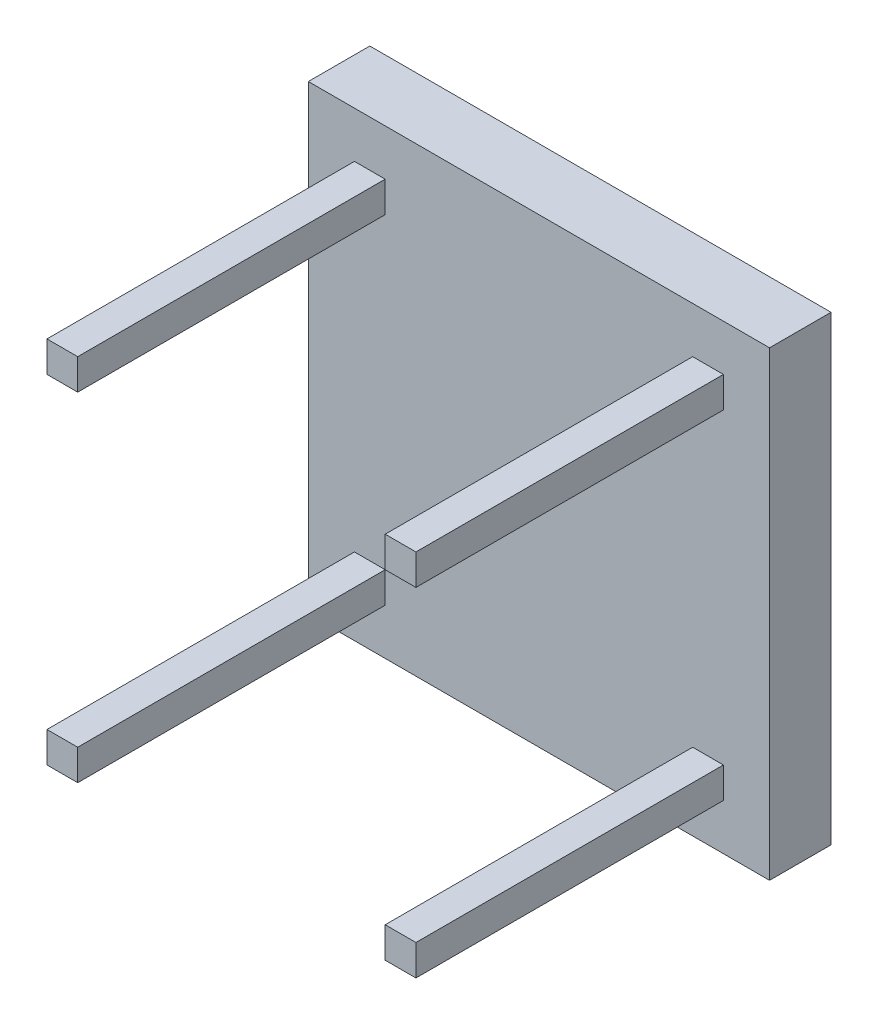
ISO-10303-21;
HEADER;
FILE_DESCRIPTION(('STEP AP214'),'2;1');
FILE_NAME('part.step','',(''),(''),'','','');
FILE_SCHEMA(('AUTOMOTIVE_DESIGN { 1 0 10303 214 1 1 1 1 }'));
ENDSEC;
DATA;
#1=APPLICATION_CONTEXT('core data for automotive mechanical design processes');
#2=APPLICATION_PROTOCOL_DEFINITION('international standard','automotive_design',2000,#1);
#3=PRODUCT_CONTEXT('',#1,'mechanical');
#4=PRODUCT('Part','Part','',(#3));
#5=PRODUCT_RELATED_PRODUCT_CATEGORY('part','',(#4));
#6=PRODUCT_DEFINITION_FORMATION('','',#4);
#7=PRODUCT_DEFINITION_CONTEXT('part definition',#1,'design');
#8=PRODUCT_DEFINITION('design','',#6,#7);
#9=PRODUCT_DEFINITION_SHAPE('','',#8);
#10=(LENGTH_UNIT() NAMED_UNIT(*) SI_UNIT(.MILLI.,.METRE.));
#11=(NAMED_UNIT(*) PLANE_ANGLE_UNIT() SI_UNIT($,.RADIAN.));
#12=(NAMED_UNIT(*) SI_UNIT($,.STERADIAN.) SOLID_ANGLE_UNIT());
#13=UNCERTAINTY_MEASURE_WITH_UNIT(LENGTH_MEASURE(1.E-05),#10,'distance_accuracy_value','');
#14=(GEOMETRIC_REPRESENTATION_CONTEXT(3) GLOBAL_UNCERTAINTY_ASSIGNED_CONTEXT((#13)) GLOBAL_UNIT_ASSIGNED_CONTEXT((#10,
#11,#12)) REPRESENTATION_CONTEXT('',''));
#15=CARTESIAN_POINT('',(0.,0.,0.));
#16=DIRECTION('',(0.,0.,1.));
#17=DIRECTION('',(1.,0.,0.));
#18=AXIS2_PLACEMENT_3D('',#15,#16,#17);
#19=CARTESIAN_POINT('',(0.,0.,40.));
#20=DIRECTION('',(0.,0.,-1.));
#21=DIRECTION('',(-1.,0.,0.));
#22=AXIS2_PLACEMENT_3D('',#19,#20,#21);
#23=PLANE('',#22);
#24=DIRECTION('',(0.,1.,0.));
#25=VECTOR('',#24,1.);
#26=CARTESIAN_POINT('',(-100.,0.,40.));
#27=LINE('',#26,#25);
#28=CARTESIAN_POINT('',(-100.,100.,40.));
#29=VERTEX_POINT('',#28);
#30=CARTESIAN_POINT('',(-100.,120.,40.));
#31=VERTEX_POINT('',#30);
#32=EDGE_CURVE('E260',#29,#31,#27,.T.);
#33=ORIENTED_EDGE('',*,*,#32,.F.);
#34=DIRECTION('',(1.,0.,0.));
#35=VECTOR('',#34,1.);
#36=CARTESIAN_POINT('',(0.,100.,40.));
#37=LINE('',#36,#35);
#38=CARTESIAN_POINT('',(-120.,100.,40.));
#39=VERTEX_POINT('',#38);
#40=EDGE_CURVE('E266',#39,#29,#37,.T.);
#41=ORIENTED_EDGE('',*,*,#40,.F.);
#42=DIRECTION('',(0.,-1.,0.));
#43=VECTOR('',#42,1.);
#44=CARTESIAN_POINT('',(-120.,0.,40.));
#45=LINE('',#44,#43);
#46=CARTESIAN_POINT('',(-120.,120.,40.));
#47=VERTEX_POINT('',#46);
#48=EDGE_CURVE('E283',#47,#39,#45,.T.);
#49=ORIENTED_EDGE('',*,*,#48,.F.);
#50=DIRECTION('',(-1.,0.,0.));
#51=VECTOR('',#50,1.);
#52=CARTESIAN_POINT('',(0.,120.,40.));
#53=LINE('',#52,#51);
#54=EDGE_CURVE('E279',#31,#47,#53,.T.);
#55=ORIENTED_EDGE('',*,*,#54,.F.);
#56=EDGE_LOOP('',(#33,#41,#49,#55));
#57=FACE_BOUND('',#56,.T.);
#58=DIRECTION('',(1.,0.,0.));
#59=VECTOR('',#58,1.);
#60=CARTESIAN_POINT('',(0.,120.,40.));
#61=LINE('',#60,#59);
#62=CARTESIAN_POINT('',(100.,120.,40.));
#63=VERTEX_POINT('',#62);
#64=CARTESIAN_POINT('',(120.,120.,40.));
#65=VERTEX_POINT('',#64);
#66=EDGE_CURVE('E327',#63,#65,#61,.T.);
#67=ORIENTED_EDGE('',*,*,#66,.T.);
#68=DIRECTION('',(0.,-1.,0.));
#69=VECTOR('',#68,1.);
#70=CARTESIAN_POINT('',(120.,2.49800180540661E-13,40.));
#71=LINE('',#70,#69);
#72=CARTESIAN_POINT('',(120.,100.,40.));
#73=VERTEX_POINT('',#72);
#74=EDGE_CURVE('E305',#65,#73,#71,.T.);
#75=ORIENTED_EDGE('',*,*,#74,.T.);
#76=DIRECTION('',(-1.,0.,0.));
#77=VECTOR('',#76,1.);
#78=CARTESIAN_POINT('',(0.,100.,40.));
#79=LINE('',#78,#77);
#80=CARTESIAN_POINT('',(100.,100.,40.));
#81=VERTEX_POINT('',#80);
#82=EDGE_CURVE('E311',#73,#81,#79,.T.);
#83=ORIENTED_EDGE('',*,*,#82,.T.);
#84=DIRECTION('',(0.,1.,0.));
#85=VECTOR('',#84,1.);
#86=CARTESIAN_POINT('',(100.,0.,40.));
#87=LINE('',#86,#85);
#88=EDGE_CURVE('E331',#81,#63,#87,.T.);
#89=ORIENTED_EDGE('',*,*,#88,.T.);
#90=EDGE_LOOP('',(#67,#75,#83,#89));
#91=FACE_BOUND('',#90,.T.);
#92=DIRECTION('',(-1.,0.,0.));
#93=VECTOR('',#92,1.);
#94=CARTESIAN_POINT('',(-150.,150.,40.));
#95=LINE('',#94,#93);
#96=CARTESIAN_POINT('',(150.,150.,40.));
#97=VERTEX_POINT('',#96);
#98=CARTESIAN_POINT('',(-150.,150.,40.));
#99=VERTEX_POINT('',#98);
#100=EDGE_CURVE('E351',#97,#99,#95,.T.);
#101=ORIENTED_EDGE('',*,*,#100,.T.);
#102=DIRECTION('',(0.,-1.,0.));
#103=VECTOR('',#102,1.);
#104=CARTESIAN_POINT('',(-150.,-150.,40.));
#105=LINE('',#104,#103);
#106=CARTESIAN_POINT('',(-150.,-150.,40.));
#107=VERTEX_POINT('',#106);
#108=EDGE_CURVE('E355',#99,#107,#105,.T.);
#109=ORIENTED_EDGE('',*,*,#108,.T.);
#110=DIRECTION('',(1.,0.,0.));
#111=VECTOR('',#110,1.);
#112=CARTESIAN_POINT('',(150.,-150.,40.));
#113=LINE('',#112,#111);
#114=CARTESIAN_POINT('',(150.,-150.,40.));
#115=VERTEX_POINT('',#114);
#116=EDGE_CURVE('E359',#107,#115,#113,.T.);
#117=ORIENTED_EDGE('',*,*,#116,.T.);
#118=DIRECTION('',(0.,1.,0.));
#119=VECTOR('',#118,1.);
#120=CARTESIAN_POINT('',(150.,150.,40.));
#121=LINE('',#120,#119);
#122=EDGE_CURVE('E362',#115,#97,#121,.T.);
#123=ORIENTED_EDGE('',*,*,#122,.T.);
#124=EDGE_LOOP('',(#101,#109,#117,#123));
#125=FACE_BOUND('',#124,.T.);
#126=DIRECTION('',(0.,1.,0.));
#127=VECTOR('',#126,1.);
#128=CARTESIAN_POINT('',(-120.,0.,40.));
#129=LINE('',#128,#127);
#130=CARTESIAN_POINT('',(-120.,-120.,40.));
#131=VERTEX_POINT('',#130);
#132=CARTESIAN_POINT('',(-120.,-100.,40.));
#133=VERTEX_POINT('',#132);
#134=EDGE_CURVE('E214',#131,#133,#129,.T.);
#135=ORIENTED_EDGE('',*,*,#134,.T.);
#136=DIRECTION('',(1.,0.,0.));
#137=VECTOR('',#136,1.);
#138=CARTESIAN_POINT('',(0.,-100.,40.));
#139=LINE('',#138,#137);
#140=CARTESIAN_POINT('',(-100.,-100.,40.));
#141=VERTEX_POINT('',#140);
#142=EDGE_CURVE('E209',#133,#141,#139,.T.);
#143=ORIENTED_EDGE('',*,*,#142,.T.);
#144=DIRECTION('',(0.,-1.,0.));
#145=VECTOR('',#144,1.);
#146=CARTESIAN_POINT('',(-100.,0.,40.));
#147=LINE('',#146,#145);
#148=CARTESIAN_POINT('',(-100.,-120.,40.));
#149=VERTEX_POINT('',#148);
#150=EDGE_CURVE('E225',#141,#149,#147,.T.);
#151=ORIENTED_EDGE('',*,*,#150,.T.);
#152=DIRECTION('',(-1.,0.,0.));
#153=VECTOR('',#152,1.);
#154=CARTESIAN_POINT('',(3.33066907387546E-13,-120.,40.));
#155=LINE('',#154,#153);
#156=EDGE_CURVE('E241',#149,#131,#155,.T.);
#157=ORIENTED_EDGE('',*,*,#156,.T.);
#158=EDGE_LOOP('',(#135,#143,#151,#157));
#159=FACE_BOUND('',#158,.T.);
#160=DIRECTION('',(-1.,0.,0.));
#161=VECTOR('',#160,1.);
#162=CARTESIAN_POINT('',(0.,-100.,40.));
#163=LINE('',#162,#161);
#164=CARTESIAN_POINT('',(120.,-100.,40.));
#165=VERTEX_POINT('',#164);
#166=CARTESIAN_POINT('',(100.,-100.,40.));
#167=VERTEX_POINT('',#166);
#168=EDGE_CURVE('E207',#165,#167,#163,.T.);
#169=ORIENTED_EDGE('',*,*,#168,.F.);
#170=DIRECTION('',(0.,1.,0.));
#171=VECTOR('',#170,1.);
#172=CARTESIAN_POINT('',(120.,-2.4980018054066E-13,40.));
#173=LINE('',#172,#171);
#174=CARTESIAN_POINT('',(120.,-120.,40.));
#175=VERTEX_POINT('',#174);
#176=EDGE_CURVE('E204',#175,#165,#173,.T.);
#177=ORIENTED_EDGE('',*,*,#176,.F.);
#178=DIRECTION('',(1.,0.,0.));
#179=VECTOR('',#178,1.);
#180=CARTESIAN_POINT('',(-3.33066907387547E-13,-120.,40.));
#181=LINE('',#180,#179);
#182=CARTESIAN_POINT('',(100.,-120.,40.));
#183=VERTEX_POINT('',#182);
#184=EDGE_CURVE('E68',#183,#175,#181,.T.);
#185=ORIENTED_EDGE('',*,*,#184,.F.);
#186=DIRECTION('',(0.,-1.,0.));
#187=VECTOR('',#186,1.);
#188=CARTESIAN_POINT('',(100.,0.,40.));
#189=LINE('',#188,#187);
#190=EDGE_CURVE('E63',#167,#183,#189,.T.);
#191=ORIENTED_EDGE('',*,*,#190,.F.);
#192=EDGE_LOOP('',(#169,#177,#185,#191));
#193=FACE_BOUND('',#192,.T.);
#194=ADVANCED_FACE('F47',(#57,#91,#125,#159,#193),#23,.F.);
#195=CARTESIAN_POINT('',(-150.,150.,40.));
#196=DIRECTION('',(0.,-1.,0.));
#197=DIRECTION('',(0.,0.,-1.));
#198=AXIS2_PLACEMENT_3D('',#195,#196,#197);
#199=PLANE('',#198);
#200=DIRECTION('',(-1.,0.,0.));
#201=VECTOR('',#200,1.);
#202=CARTESIAN_POINT('',(-150.,150.,0.));
#203=LINE('',#202,#201);
#204=CARTESIAN_POINT('',(150.,150.,0.));
#205=VERTEX_POINT('',#204);
#206=CARTESIAN_POINT('',(-150.,150.,0.));
#207=VERTEX_POINT('',#206);
#208=EDGE_CURVE('E350',#205,#207,#203,.T.);
#209=ORIENTED_EDGE('',*,*,#208,.T.);
#210=DIRECTION('',(0.,0.,-1.));
#211=VECTOR('',#210,1.);
#212=CARTESIAN_POINT('',(-150.,150.,40.));
#213=LINE('',#212,#211);
#214=EDGE_CURVE('E11',#99,#207,#213,.T.);
#215=ORIENTED_EDGE('',*,*,#214,.F.);
#216=ORIENTED_EDGE('',*,*,#100,.F.);
#217=DIRECTION('',(0.,0.,-1.));
#218=VECTOR('',#217,1.);
#219=CARTESIAN_POINT('',(150.,150.,40.));
#220=LINE('',#219,#218);
#221=EDGE_CURVE('E365',#97,#205,#220,.T.);
#222=ORIENTED_EDGE('',*,*,#221,.T.);
#223=EDGE_LOOP('',(#209,#215,#216,#222));
#224=FACE_BOUND('',#223,.T.);
#225=ADVANCED_FACE('F49',(#224),#199,.F.);
#226=CARTESIAN_POINT('',(-150.,-150.,40.));
#227=DIRECTION('',(1.,0.,0.));
#228=DIRECTION('',(0.,1.,0.));
#229=AXIS2_PLACEMENT_3D('',#226,#227,#228);
#230=PLANE('',#229);
#231=DIRECTION('',(0.,-1.,0.));
#232=VECTOR('',#231,1.);
#233=CARTESIAN_POINT('',(-150.,-150.,0.));
#234=LINE('',#233,#232);
#235=CARTESIAN_POINT('',(-150.,-150.,0.));
#236=VERTEX_POINT('',#235);
#237=EDGE_CURVE('E369',#207,#236,#234,.T.);
#238=ORIENTED_EDGE('',*,*,#237,.T.);
#239=DIRECTION('',(0.,0.,-1.));
#240=VECTOR('',#239,1.);
#241=CARTESIAN_POINT('',(-150.,-150.,40.));
#242=LINE('',#241,#240);
#243=EDGE_CURVE('E56',#107,#236,#242,.T.);
#244=ORIENTED_EDGE('',*,*,#243,.F.);
#245=ORIENTED_EDGE('',*,*,#108,.F.);
#246=ORIENTED_EDGE('',*,*,#214,.T.);
#247=EDGE_LOOP('',(#238,#244,#245,#246));
#248=FACE_BOUND('',#247,.T.);
#249=ADVANCED_FACE('F405',(#248),#230,.F.);
#250=CARTESIAN_POINT('',(150.,-150.,40.));
#251=DIRECTION('',(0.,1.,0.));
#252=DIRECTION('',(0.,0.,1.));
#253=AXIS2_PLACEMENT_3D('',#250,#251,#252);
#254=PLANE('',#253);
#255=DIRECTION('',(1.,0.,0.));
#256=VECTOR('',#255,1.);
#257=CARTESIAN_POINT('',(150.,-150.,0.));
#258=LINE('',#257,#256);
#259=CARTESIAN_POINT('',(150.,-150.,0.));
#260=VERTEX_POINT('',#259);
#261=EDGE_CURVE('E372',#236,#260,#258,.T.);
#262=ORIENTED_EDGE('',*,*,#261,.T.);
#263=DIRECTION('',(0.,0.,-1.));
#264=VECTOR('',#263,1.);
#265=CARTESIAN_POINT('',(150.,-150.,40.));
#266=LINE('',#265,#264);
#267=EDGE_CURVE('E380',#115,#260,#266,.T.);
#268=ORIENTED_EDGE('',*,*,#267,.F.);
#269=ORIENTED_EDGE('',*,*,#116,.F.);
#270=ORIENTED_EDGE('',*,*,#243,.T.);
#271=EDGE_LOOP('',(#262,#268,#269,#270));
#272=FACE_BOUND('',#271,.T.);
#273=ADVANCED_FACE('F389',(#272),#254,.F.);
#274=CARTESIAN_POINT('',(150.,150.,40.));
#275=DIRECTION('',(-1.,0.,0.));
#276=DIRECTION('',(0.,0.,1.));
#277=AXIS2_PLACEMENT_3D('',#274,#275,#276);
#278=PLANE('',#277);
#279=DIRECTION('',(0.,1.,0.));
#280=VECTOR('',#279,1.);
#281=CARTESIAN_POINT('',(150.,150.,0.));
#282=LINE('',#281,#280);
#283=EDGE_CURVE('E356',#260,#205,#282,.T.);
#284=ORIENTED_EDGE('',*,*,#283,.T.);
#285=ORIENTED_EDGE('',*,*,#221,.F.);
#286=ORIENTED_EDGE('',*,*,#122,.F.);
#287=ORIENTED_EDGE('',*,*,#267,.T.);
#288=EDGE_LOOP('',(#284,#285,#286,#287));
#289=FACE_BOUND('',#288,.T.);
#290=ADVANCED_FACE('F398',(#289),#278,.F.);
#291=CARTESIAN_POINT('',(0.,0.,0.));
#292=DIRECTION('',(0.,0.,-1.));
#293=DIRECTION('',(-1.,0.,0.));
#294=AXIS2_PLACEMENT_3D('',#291,#292,#293);
#295=PLANE('',#294);
#296=ORIENTED_EDGE('',*,*,#208,.F.);
#297=ORIENTED_EDGE('',*,*,#283,.F.);
#298=ORIENTED_EDGE('',*,*,#261,.F.);
#299=ORIENTED_EDGE('',*,*,#237,.F.);
#300=EDGE_LOOP('',(#296,#297,#298,#299));
#301=FACE_BOUND('',#300,.T.);
#302=ADVANCED_FACE('F395',(#301),#295,.T.);
#303=CARTESIAN_POINT('',(120.,2.49800180540661E-13,240.));
#304=DIRECTION('',(1.,0.,0.));
#305=DIRECTION('',(0.,1.,0.));
#306=AXIS2_PLACEMENT_3D('',#303,#304,#305);
#307=PLANE('',#306);
#308=ORIENTED_EDGE('',*,*,#74,.F.);
#309=DIRECTION('',(0.,0.,-1.));
#310=VECTOR('',#309,1.);
#311=CARTESIAN_POINT('',(120.,120.,240.));
#312=LINE('',#311,#310);
#313=CARTESIAN_POINT('',(120.,120.,240.));
#314=VERTEX_POINT('',#313);
#315=EDGE_CURVE('E347',#314,#65,#312,.T.);
#316=ORIENTED_EDGE('',*,*,#315,.F.);
#317=DIRECTION('',(0.,-1.,0.));
#318=VECTOR('',#317,1.);
#319=CARTESIAN_POINT('',(120.,2.49800180540661E-13,240.));
#320=LINE('',#319,#318);
#321=CARTESIAN_POINT('',(120.,100.,240.));
#322=VERTEX_POINT('',#321);
#323=EDGE_CURVE('E306',#314,#322,#320,.T.);
#324=ORIENTED_EDGE('',*,*,#323,.T.);
#325=DIRECTION('',(0.,0.,-1.));
#326=VECTOR('',#325,1.);
#327=CARTESIAN_POINT('',(120.,100.,240.));
#328=LINE('',#327,#326);
#329=EDGE_CURVE('E323',#322,#73,#328,.T.);
#330=ORIENTED_EDGE('',*,*,#329,.T.);
#331=EDGE_LOOP('',(#308,#316,#324,#330));
#332=FACE_BOUND('',#331,.T.);
#333=ADVANCED_FACE('F422',(#332),#307,.T.);
#334=CARTESIAN_POINT('',(0.,120.,240.));
#335=DIRECTION('',(0.,1.,0.));
#336=DIRECTION('',(0.,0.,1.));
#337=AXIS2_PLACEMENT_3D('',#334,#335,#336);
#338=PLANE('',#337);
#339=ORIENTED_EDGE('',*,*,#66,.F.);
#340=DIRECTION('',(0.,0.,-1.));
#341=VECTOR('',#340,1.);
#342=CARTESIAN_POINT('',(100.,120.,240.));
#343=LINE('',#342,#341);
#344=CARTESIAN_POINT('',(100.,120.,240.));
#345=VERTEX_POINT('',#344);
#346=EDGE_CURVE('E344',#345,#63,#343,.T.);
#347=ORIENTED_EDGE('',*,*,#346,.F.);
#348=DIRECTION('',(1.,0.,0.));
#349=VECTOR('',#348,1.);
#350=CARTESIAN_POINT('',(0.,120.,240.));
#351=LINE('',#350,#349);
#352=EDGE_CURVE('E310',#345,#314,#351,.T.);
#353=ORIENTED_EDGE('',*,*,#352,.T.);
#354=ORIENTED_EDGE('',*,*,#315,.T.);
#355=EDGE_LOOP('',(#339,#347,#353,#354));
#356=FACE_BOUND('',#355,.T.);
#357=ADVANCED_FACE('F448',(#356),#338,.T.);
#358=CARTESIAN_POINT('',(100.,0.,240.));
#359=DIRECTION('',(-1.,0.,0.));
#360=DIRECTION('',(0.,0.,1.));
#361=AXIS2_PLACEMENT_3D('',#358,#359,#360);
#362=PLANE('',#361);
#363=ORIENTED_EDGE('',*,*,#88,.F.);
#364=DIRECTION('',(0.,0.,-1.));
#365=VECTOR('',#364,1.);
#366=CARTESIAN_POINT('',(100.,100.,240.));
#367=LINE('',#366,#365);
#368=CARTESIAN_POINT('',(100.,100.,240.));
#369=VERTEX_POINT('',#368);
#370=EDGE_CURVE('E340',#369,#81,#367,.T.);
#371=ORIENTED_EDGE('',*,*,#370,.F.);
#372=DIRECTION('',(0.,1.,0.));
#373=VECTOR('',#372,1.);
#374=CARTESIAN_POINT('',(100.,0.,240.));
#375=LINE('',#374,#373);
#376=EDGE_CURVE('E315',#369,#345,#375,.T.);
#377=ORIENTED_EDGE('',*,*,#376,.T.);
#378=ORIENTED_EDGE('',*,*,#346,.T.);
#379=EDGE_LOOP('',(#363,#371,#377,#378));
#380=FACE_BOUND('',#379,.T.);
#381=ADVANCED_FACE('F457',(#380),#362,.T.);
#382=CARTESIAN_POINT('',(0.,100.,240.));
#383=DIRECTION('',(0.,-1.,0.));
#384=DIRECTION('',(0.,0.,-1.));
#385=AXIS2_PLACEMENT_3D('',#382,#383,#384);
#386=PLANE('',#385);
#387=ORIENTED_EDGE('',*,*,#82,.F.);
#388=ORIENTED_EDGE('',*,*,#329,.F.);
#389=DIRECTION('',(-1.,0.,0.));
#390=VECTOR('',#389,1.);
#391=CARTESIAN_POINT('',(0.,100.,240.));
#392=LINE('',#391,#390);
#393=EDGE_CURVE('E319',#322,#369,#392,.T.);
#394=ORIENTED_EDGE('',*,*,#393,.T.);
#395=ORIENTED_EDGE('',*,*,#370,.T.);
#396=EDGE_LOOP('',(#387,#388,#394,#395));
#397=FACE_BOUND('',#396,.T.);
#398=ADVANCED_FACE('F466',(#397),#386,.T.);
#399=CARTESIAN_POINT('',(0.,0.,240.));
#400=DIRECTION('',(0.,0.,1.));
#401=DIRECTION('',(1.,0.,0.));
#402=AXIS2_PLACEMENT_3D('',#399,#400,#401);
#403=PLANE('',#402);
#404=ORIENTED_EDGE('',*,*,#323,.F.);
#405=ORIENTED_EDGE('',*,*,#352,.F.);
#406=ORIENTED_EDGE('',*,*,#376,.F.);
#407=ORIENTED_EDGE('',*,*,#393,.F.);
#408=EDGE_LOOP('',(#404,#405,#406,#407));
#409=FACE_BOUND('',#408,.T.);
#410=ADVANCED_FACE('F476',(#409),#403,.T.);
#411=CARTESIAN_POINT('',(-100.,0.,240.));
#412=DIRECTION('',(-1.,0.,0.));
#413=DIRECTION('',(0.,0.,1.));
#414=AXIS2_PLACEMENT_3D('',#411,#412,#413);
#415=PLANE('',#414);
#416=ORIENTED_EDGE('',*,*,#32,.T.);
#417=DIRECTION('',(0.,0.,-1.));
#418=VECTOR('',#417,1.);
#419=CARTESIAN_POINT('',(-100.,120.,240.));
#420=LINE('',#419,#418);
#421=CARTESIAN_POINT('',(-100.,120.,240.));
#422=VERTEX_POINT('',#421);
#423=EDGE_CURVE('E301',#422,#31,#420,.T.);
#424=ORIENTED_EDGE('',*,*,#423,.F.);
#425=DIRECTION('',(0.,1.,0.));
#426=VECTOR('',#425,1.);
#427=CARTESIAN_POINT('',(-100.,0.,240.));
#428=LINE('',#427,#426);
#429=CARTESIAN_POINT('',(-100.,100.,240.));
#430=VERTEX_POINT('',#429);
#431=EDGE_CURVE('E261',#430,#422,#428,.T.);
#432=ORIENTED_EDGE('',*,*,#431,.F.);
#433=DIRECTION('',(0.,0.,-1.));
#434=VECTOR('',#433,1.);
#435=CARTESIAN_POINT('',(-100.,100.,240.));
#436=LINE('',#435,#434);
#437=EDGE_CURVE('E275',#430,#29,#436,.T.);
#438=ORIENTED_EDGE('',*,*,#437,.T.);
#439=EDGE_LOOP('',(#416,#424,#432,#438));
#440=FACE_BOUND('',#439,.T.);
#441=ADVANCED_FACE('F486',(#440),#415,.F.);
#442=CARTESIAN_POINT('',(0.,120.,240.));
#443=DIRECTION('',(0.,-1.,0.));
#444=DIRECTION('',(0.,0.,-1.));
#445=AXIS2_PLACEMENT_3D('',#442,#443,#444);
#446=PLANE('',#445);
#447=ORIENTED_EDGE('',*,*,#54,.T.);
#448=DIRECTION('',(0.,0.,-1.));
#449=VECTOR('',#448,1.);
#450=CARTESIAN_POINT('',(-120.,120.,240.));
#451=LINE('',#450,#449);
#452=CARTESIAN_POINT('',(-120.,120.,240.));
#453=VERTEX_POINT('',#452);
#454=EDGE_CURVE('E297',#453,#47,#451,.T.);
#455=ORIENTED_EDGE('',*,*,#454,.F.);
#456=DIRECTION('',(-1.,0.,0.));
#457=VECTOR('',#456,1.);
#458=CARTESIAN_POINT('',(0.,120.,240.));
#459=LINE('',#458,#457);
#460=EDGE_CURVE('E265',#422,#453,#459,.T.);
#461=ORIENTED_EDGE('',*,*,#460,.F.);
#462=ORIENTED_EDGE('',*,*,#423,.T.);
#463=EDGE_LOOP('',(#447,#455,#461,#462));
#464=FACE_BOUND('',#463,.T.);
#465=ADVANCED_FACE('F496',(#464),#446,.F.);
#466=CARTESIAN_POINT('',(-120.,0.,240.));
#467=DIRECTION('',(1.,0.,0.));
#468=DIRECTION('',(0.,1.,0.));
#469=AXIS2_PLACEMENT_3D('',#466,#467,#468);
#470=PLANE('',#469);
#471=ORIENTED_EDGE('',*,*,#48,.T.);
#472=DIRECTION('',(0.,0.,-1.));
#473=VECTOR('',#472,1.);
#474=CARTESIAN_POINT('',(-120.,100.,240.));
#475=LINE('',#474,#473);
#476=CARTESIAN_POINT('',(-120.,100.,240.));
#477=VERTEX_POINT('',#476);
#478=EDGE_CURVE('E293',#477,#39,#475,.T.);
#479=ORIENTED_EDGE('',*,*,#478,.F.);
#480=DIRECTION('',(0.,-1.,0.));
#481=VECTOR('',#480,1.);
#482=CARTESIAN_POINT('',(-120.,0.,240.));
#483=LINE('',#482,#481);
#484=EDGE_CURVE('E269',#453,#477,#483,.T.);
#485=ORIENTED_EDGE('',*,*,#484,.F.);
#486=ORIENTED_EDGE('',*,*,#454,.T.);
#487=EDGE_LOOP('',(#471,#479,#485,#486));
#488=FACE_BOUND('',#487,.T.);
#489=ADVANCED_FACE('F506',(#488),#470,.F.);
#490=CARTESIAN_POINT('',(0.,100.,240.));
#491=DIRECTION('',(0.,1.,0.));
#492=DIRECTION('',(0.,0.,1.));
#493=AXIS2_PLACEMENT_3D('',#490,#491,#492);
#494=PLANE('',#493);
#495=ORIENTED_EDGE('',*,*,#40,.T.);
#496=ORIENTED_EDGE('',*,*,#437,.F.);
#497=DIRECTION('',(1.,0.,0.));
#498=VECTOR('',#497,1.);
#499=CARTESIAN_POINT('',(0.,100.,240.));
#500=LINE('',#499,#498);
#501=EDGE_CURVE('E272',#477,#430,#500,.T.);
#502=ORIENTED_EDGE('',*,*,#501,.F.);
#503=ORIENTED_EDGE('',*,*,#478,.T.);
#504=EDGE_LOOP('',(#495,#496,#502,#503));
#505=FACE_BOUND('',#504,.T.);
#506=ADVANCED_FACE('F516',(#505),#494,.F.);
#507=CARTESIAN_POINT('',(0.,0.,240.));
#508=DIRECTION('',(0.,0.,1.));
#509=DIRECTION('',(1.,0.,0.));
#510=AXIS2_PLACEMENT_3D('',#507,#508,#509);
#511=PLANE('',#510);
#512=ORIENTED_EDGE('',*,*,#431,.T.);
#513=ORIENTED_EDGE('',*,*,#460,.T.);
#514=ORIENTED_EDGE('',*,*,#484,.T.);
#515=ORIENTED_EDGE('',*,*,#501,.T.);
#516=EDGE_LOOP('',(#512,#513,#514,#515));
#517=FACE_BOUND('',#516,.T.);
#518=ADVANCED_FACE('F526',(#517),#511,.T.);
#519=CARTESIAN_POINT('',(0.,-100.,240.));
#520=DIRECTION('',(0.,1.,0.));
#521=DIRECTION('',(0.,0.,1.));
#522=AXIS2_PLACEMENT_3D('',#519,#520,#521);
#523=PLANE('',#522);
#524=ORIENTED_EDGE('',*,*,#142,.F.);
#525=DIRECTION('',(0.,0.,-1.));
#526=VECTOR('',#525,1.);
#527=CARTESIAN_POINT('',(-120.,-100.,240.));
#528=LINE('',#527,#526);
#529=CARTESIAN_POINT('',(-120.,-100.,240.));
#530=VERTEX_POINT('',#529);
#531=EDGE_CURVE('E257',#530,#133,#528,.T.);
#532=ORIENTED_EDGE('',*,*,#531,.F.);
#533=DIRECTION('',(1.,0.,0.));
#534=VECTOR('',#533,1.);
#535=CARTESIAN_POINT('',(0.,-100.,240.));
#536=LINE('',#535,#534);
#537=CARTESIAN_POINT('',(-100.,-100.,240.));
#538=VERTEX_POINT('',#537);
#539=EDGE_CURVE('E220',#530,#538,#536,.T.);
#540=ORIENTED_EDGE('',*,*,#539,.T.);
#541=DIRECTION('',(0.,0.,-1.));
#542=VECTOR('',#541,1.);
#543=CARTESIAN_POINT('',(-100.,-100.,240.));
#544=LINE('',#543,#542);
#545=EDGE_CURVE('E236',#538,#141,#544,.T.);
#546=ORIENTED_EDGE('',*,*,#545,.T.);
#547=EDGE_LOOP('',(#524,#532,#540,#546));
#548=FACE_BOUND('',#547,.T.);
#549=ADVANCED_FACE('F536',(#548),#523,.T.);
#550=CARTESIAN_POINT('',(-120.,0.,240.));
#551=DIRECTION('',(-1.,0.,0.));
#552=DIRECTION('',(0.,-1.,0.));
#553=AXIS2_PLACEMENT_3D('',#550,#551,#552);
#554=PLANE('',#553);
#555=ORIENTED_EDGE('',*,*,#134,.F.);
#556=DIRECTION('',(0.,0.,-1.));
#557=VECTOR('',#556,1.);
#558=CARTESIAN_POINT('',(-120.,-120.,240.));
#559=LINE('',#558,#557);
#560=CARTESIAN_POINT('',(-120.,-120.,240.));
#561=VERTEX_POINT('',#560);
#562=EDGE_CURVE('E254',#561,#131,#559,.T.);
#563=ORIENTED_EDGE('',*,*,#562,.F.);
#564=DIRECTION('',(0.,1.,0.));
#565=VECTOR('',#564,1.);
#566=CARTESIAN_POINT('',(-120.,0.,240.));
#567=LINE('',#566,#565);
#568=EDGE_CURVE('E224',#561,#530,#567,.T.);
#569=ORIENTED_EDGE('',*,*,#568,.T.);
#570=ORIENTED_EDGE('',*,*,#531,.T.);
#571=EDGE_LOOP('',(#555,#563,#569,#570));
#572=FACE_BOUND('',#571,.T.);
#573=ADVANCED_FACE('F546',(#572),#554,.T.);
#574=CARTESIAN_POINT('',(3.33066907387546E-13,-120.,240.));
#575=DIRECTION('',(0.,-1.,0.));
#576=DIRECTION('',(1.,0.,0.));
#577=AXIS2_PLACEMENT_3D('',#574,#575,#576);
#578=PLANE('',#577);
#579=ORIENTED_EDGE('',*,*,#156,.F.);
#580=DIRECTION('',(0.,0.,-1.));
#581=VECTOR('',#580,1.);
#582=CARTESIAN_POINT('',(-100.,-120.,240.));
#583=LINE('',#582,#581);
#584=CARTESIAN_POINT('',(-100.,-120.,240.));
#585=VERTEX_POINT('',#584);
#586=EDGE_CURVE('E250',#585,#149,#583,.T.);
#587=ORIENTED_EDGE('',*,*,#586,.F.);
#588=DIRECTION('',(-1.,0.,0.));
#589=VECTOR('',#588,1.);
#590=CARTESIAN_POINT('',(3.33066907387546E-13,-120.,240.));
#591=LINE('',#590,#589);
#592=EDGE_CURVE('E229',#585,#561,#591,.T.);
#593=ORIENTED_EDGE('',*,*,#592,.T.);
#594=ORIENTED_EDGE('',*,*,#562,.T.);
#595=EDGE_LOOP('',(#579,#587,#593,#594));
#596=FACE_BOUND('',#595,.T.);
#597=ADVANCED_FACE('F556',(#596),#578,.T.);
#598=CARTESIAN_POINT('',(-100.,0.,240.));
#599=DIRECTION('',(1.,0.,0.));
#600=DIRECTION('',(0.,0.,-1.));
#601=AXIS2_PLACEMENT_3D('',#598,#599,#600);
#602=PLANE('',#601);
#603=ORIENTED_EDGE('',*,*,#150,.F.);
#604=ORIENTED_EDGE('',*,*,#545,.F.);
#605=DIRECTION('',(0.,-1.,0.));
#606=VECTOR('',#605,1.);
#607=CARTESIAN_POINT('',(-100.,0.,240.));
#608=LINE('',#607,#606);
#609=EDGE_CURVE('E233',#538,#585,#608,.T.);
#610=ORIENTED_EDGE('',*,*,#609,.T.);
#611=ORIENTED_EDGE('',*,*,#586,.T.);
#612=EDGE_LOOP('',(#603,#604,#610,#611));
#613=FACE_BOUND('',#612,.T.);
#614=ADVANCED_FACE('F566',(#613),#602,.T.);
#615=CARTESIAN_POINT('',(0.,0.,240.));
#616=DIRECTION('',(0.,0.,1.));
#617=DIRECTION('',(1.,0.,0.));
#618=AXIS2_PLACEMENT_3D('',#615,#616,#617);
#619=PLANE('',#618);
#620=ORIENTED_EDGE('',*,*,#539,.F.);
#621=ORIENTED_EDGE('',*,*,#568,.F.);
#622=ORIENTED_EDGE('',*,*,#592,.F.);
#623=ORIENTED_EDGE('',*,*,#609,.F.);
#624=EDGE_LOOP('',(#620,#621,#622,#623));
#625=FACE_BOUND('',#624,.T.);
#626=ADVANCED_FACE('F576',(#625),#619,.T.);
#627=CARTESIAN_POINT('',(0.,-100.,240.));
#628=DIRECTION('',(0.,-1.,0.));
#629=DIRECTION('',(0.,0.,-1.));
#630=AXIS2_PLACEMENT_3D('',#627,#628,#629);
#631=PLANE('',#630);
#632=ORIENTED_EDGE('',*,*,#168,.T.);
#633=DIRECTION('',(0.,0.,-1.));
#634=VECTOR('',#633,1.);
#635=CARTESIAN_POINT('',(100.,-100.,240.));
#636=LINE('',#635,#634);
#637=CARTESIAN_POINT('',(100.,-100.,240.));
#638=VERTEX_POINT('',#637);
#639=EDGE_CURVE('E186',#638,#167,#636,.T.);
#640=ORIENTED_EDGE('',*,*,#639,.F.);
#641=DIRECTION('',(-1.,0.,0.));
#642=VECTOR('',#641,1.);
#643=CARTESIAN_POINT('',(0.,-100.,240.));
#644=LINE('',#643,#642);
#645=CARTESIAN_POINT('',(120.,-100.,240.));
#646=VERTEX_POINT('',#645);
#647=EDGE_CURVE('E194',#646,#638,#644,.T.);
#648=ORIENTED_EDGE('',*,*,#647,.F.);
#649=DIRECTION('',(0.,0.,-1.));
#650=VECTOR('',#649,1.);
#651=CARTESIAN_POINT('',(120.,-100.,240.));
#652=LINE('',#651,#650);
#653=EDGE_CURVE('E635',#646,#165,#652,.T.);
#654=ORIENTED_EDGE('',*,*,#653,.T.);
#655=EDGE_LOOP('',(#632,#640,#648,#654));
#656=FACE_BOUND('',#655,.T.);
#657=ADVANCED_FACE('F206',(#656),#631,.F.);
#658=CARTESIAN_POINT('',(100.,0.,240.));
#659=DIRECTION('',(1.,0.,0.));
#660=DIRECTION('',(0.,0.,-1.));
#661=AXIS2_PLACEMENT_3D('',#658,#659,#660);
#662=PLANE('',#661);
#663=ORIENTED_EDGE('',*,*,#190,.T.);
#664=DIRECTION('',(0.,0.,-1.));
#665=VECTOR('',#664,1.);
#666=CARTESIAN_POINT('',(100.,-120.,240.));
#667=LINE('',#666,#665);
#668=CARTESIAN_POINT('',(100.,-120.,240.));
#669=VERTEX_POINT('',#668);
#670=EDGE_CURVE('E189',#669,#183,#667,.T.);
#671=ORIENTED_EDGE('',*,*,#670,.F.);
#672=DIRECTION('',(0.,-1.,0.));
#673=VECTOR('',#672,1.);
#674=CARTESIAN_POINT('',(100.,0.,240.));
#675=LINE('',#674,#673);
#676=EDGE_CURVE('E182',#638,#669,#675,.T.);
#677=ORIENTED_EDGE('',*,*,#676,.F.);
#678=ORIENTED_EDGE('',*,*,#639,.T.);
#679=EDGE_LOOP('',(#663,#671,#677,#678));
#680=FACE_BOUND('',#679,.T.);
#681=ADVANCED_FACE('F184',(#680),#662,.F.);
#682=CARTESIAN_POINT('',(-3.33066907387547E-13,-120.,240.));
#683=DIRECTION('',(0.,1.,0.));
#684=DIRECTION('',(-1.,0.,0.));
#685=AXIS2_PLACEMENT_3D('',#682,#683,#684);
#686=PLANE('',#685);
#687=ORIENTED_EDGE('',*,*,#184,.T.);
#688=DIRECTION('',(0.,0.,-1.));
#689=VECTOR('',#688,1.);
#690=CARTESIAN_POINT('',(120.,-120.,240.));
#691=LINE('',#690,#689);
#692=CARTESIAN_POINT('',(120.,-120.,240.));
#693=VERTEX_POINT('',#692);
#694=EDGE_CURVE('E216',#693,#175,#691,.T.);
#695=ORIENTED_EDGE('',*,*,#694,.F.);
#696=DIRECTION('',(1.,0.,0.));
#697=VECTOR('',#696,1.);
#698=CARTESIAN_POINT('',(-3.33066907387547E-13,-120.,240.));
#699=LINE('',#698,#697);
#700=EDGE_CURVE('E193',#669,#693,#699,.T.);
#701=ORIENTED_EDGE('',*,*,#700,.F.);
#702=ORIENTED_EDGE('',*,*,#670,.T.);
#703=EDGE_LOOP('',(#687,#695,#701,#702));
#704=FACE_BOUND('',#703,.T.);
#705=ADVANCED_FACE('F603',(#704),#686,.F.);
#706=CARTESIAN_POINT('',(120.,-2.4980018054066E-13,240.));
#707=DIRECTION('',(-1.,0.,0.));
#708=DIRECTION('',(0.,-1.,0.));
#709=AXIS2_PLACEMENT_3D('',#706,#707,#708);
#710=PLANE('',#709);
#711=ORIENTED_EDGE('',*,*,#176,.T.);
#712=ORIENTED_EDGE('',*,*,#653,.F.);
#713=DIRECTION('',(0.,1.,0.));
#714=VECTOR('',#713,1.);
#715=CARTESIAN_POINT('',(120.,-2.4980018054066E-13,240.));
#716=LINE('',#715,#714);
#717=EDGE_CURVE('E199',#693,#646,#716,.T.);
#718=ORIENTED_EDGE('',*,*,#717,.F.);
#719=ORIENTED_EDGE('',*,*,#694,.T.);
#720=EDGE_LOOP('',(#711,#712,#718,#719));
#721=FACE_BOUND('',#720,.T.);
#722=ADVANCED_FACE('F612',(#721),#710,.F.);
#723=CARTESIAN_POINT('',(0.,0.,240.));
#724=DIRECTION('',(0.,0.,1.));
#725=DIRECTION('',(1.,0.,0.));
#726=AXIS2_PLACEMENT_3D('',#723,#724,#725);
#727=PLANE('',#726);
#728=ORIENTED_EDGE('',*,*,#647,.T.);
#729=ORIENTED_EDGE('',*,*,#676,.T.);
#730=ORIENTED_EDGE('',*,*,#700,.T.);
#731=ORIENTED_EDGE('',*,*,#717,.T.);
#732=EDGE_LOOP('',(#728,#729,#730,#731));
#733=FACE_BOUND('',#732,.T.);
#734=ADVANCED_FACE('F197',(#733),#727,.T.);
#735=CLOSED_SHELL('',(#194,#225,#249,#273,#290,#302,#333,#357,#381,#398,#410,#441,#465,#489,
#506,#518,#549,#573,#597,#614,#626,#657,#681,#705,#722,#734));
#736=MANIFOLD_SOLID_BREP('B2',#735);
#737=ADVANCED_BREP_SHAPE_REPRESENTATION('',(#18,#736),#14);
#738=SHAPE_DEFINITION_REPRESENTATION(#9,#737);
ENDSEC;
END-ISO-10303-21;
